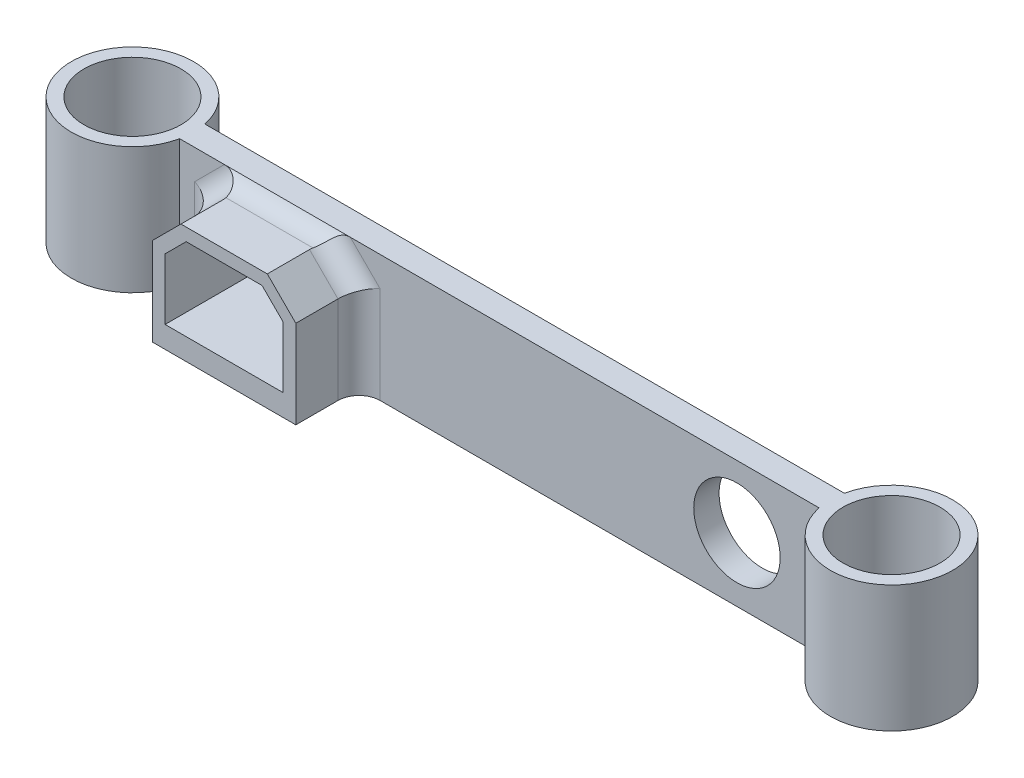
ISO-10303-21;
HEADER;
FILE_DESCRIPTION(('STEP AP214'),'2;1');
FILE_NAME('part.step','',(''),(''),'','','');
FILE_SCHEMA(('AUTOMOTIVE_DESIGN { 1 0 10303 214 1 1 1 1 }'));
ENDSEC;
DATA;
#1=APPLICATION_CONTEXT('core data for automotive mechanical design processes');
#2=APPLICATION_PROTOCOL_DEFINITION('international standard','automotive_design',2000,#1);
#3=PRODUCT_CONTEXT('',#1,'mechanical');
#4=PRODUCT('Part','Part','',(#3));
#5=PRODUCT_RELATED_PRODUCT_CATEGORY('part','',(#4));
#6=PRODUCT_DEFINITION_FORMATION('','',#4);
#7=PRODUCT_DEFINITION_CONTEXT('part definition',#1,'design');
#8=PRODUCT_DEFINITION('design','',#6,#7);
#9=PRODUCT_DEFINITION_SHAPE('','',#8);
#10=(LENGTH_UNIT() NAMED_UNIT(*) SI_UNIT(.MILLI.,.METRE.));
#11=(NAMED_UNIT(*) PLANE_ANGLE_UNIT() SI_UNIT($,.RADIAN.));
#12=(NAMED_UNIT(*) SI_UNIT($,.STERADIAN.) SOLID_ANGLE_UNIT());
#13=UNCERTAINTY_MEASURE_WITH_UNIT(LENGTH_MEASURE(1.E-05),#10,'distance_accuracy_value','');
#14=(GEOMETRIC_REPRESENTATION_CONTEXT(3) GLOBAL_UNCERTAINTY_ASSIGNED_CONTEXT((#13)) GLOBAL_UNIT_ASSIGNED_CONTEXT((#10,
#11,#12)) REPRESENTATION_CONTEXT('',''));
#15=CARTESIAN_POINT('',(0.,0.,0.));
#16=DIRECTION('',(0.,0.,1.));
#17=DIRECTION('',(1.,0.,0.));
#18=AXIS2_PLACEMENT_3D('',#15,#16,#17);
#19=CARTESIAN_POINT('',(-28.3531574831731,30.,3.00000000000001));
#20=DIRECTION('',(0.,0.,-1.));
#21=DIRECTION('',(-1.,0.,0.));
#22=AXIS2_PLACEMENT_3D('',#19,#20,#21);
#23=PLANE('',#22);
#24=DIRECTION('',(1.,0.,0.));
#25=VECTOR('',#24,1.);
#26=CARTESIAN_POINT('',(-28.3531574831731,0.,3.00000000000001));
#27=LINE('',#26,#25);
#28=CARTESIAN_POINT('',(-28.3531574831731,0.,3.00000000000001));
#29=VERTEX_POINT('',#28);
#30=CARTESIAN_POINT('',(-24.8018551834996,0.,3.00000000000001));
#31=VERTEX_POINT('',#30);
#32=EDGE_CURVE('E282',#29,#31,#27,.T.);
#33=ORIENTED_EDGE('',*,*,#32,.T.);
#34=DIRECTION('',(0.,-1.,0.));
#35=VECTOR('',#34,1.);
#36=CARTESIAN_POINT('',(-24.8018551834996,20.8662593786184,3.00000000000001));
#37=LINE('',#36,#35);
#38=CARTESIAN_POINT('',(-24.8018551834996,22.9373271904839,3.00000000000001));
#39=VERTEX_POINT('',#38);
#40=EDGE_CURVE('E319',#31,#39,#37,.F.);
#41=ORIENTED_EDGE('',*,*,#40,.T.);
#42=DIRECTION('',(-0.707106781186547,-0.707106781186548,0.));
#43=VECTOR('',#42,1.);
#44=CARTESIAN_POINT('',(-16.5800297765516,31.1591525974319,3.00000000000001));
#45=LINE('',#44,#43);
#46=CARTESIAN_POINT('',(-17.7391823739835,30.,3.00000000000001));
#47=VERTEX_POINT('',#46);
#48=EDGE_CURVE('E317',#39,#47,#45,.F.);
#49=ORIENTED_EDGE('',*,*,#48,.T.);
#50=DIRECTION('',(1.,0.,0.));
#51=VECTOR('',#50,1.);
#52=CARTESIAN_POINT('',(-28.3531574831731,30.,3.00000000000001));
#53=LINE('',#52,#51);
#54=CARTESIAN_POINT('',(-28.3531574831731,30.,3.00000000000001));
#55=VERTEX_POINT('',#54);
#56=EDGE_CURVE('E270',#55,#47,#53,.T.);
#57=ORIENTED_EDGE('',*,*,#56,.F.);
#58=DIRECTION('',(0.,-1.,0.));
#59=VECTOR('',#58,1.);
#60=CARTESIAN_POINT('',(-28.3531574831731,30.,3.00000000000001));
#61=LINE('',#60,#59);
#62=EDGE_CURVE('E296',#55,#29,#61,.T.);
#63=ORIENTED_EDGE('',*,*,#62,.T.);
#64=EDGE_LOOP('',(#33,#41,#49,#57,#63));
#65=FACE_BOUND('',#64,.T.);
#66=ADVANCED_FACE('F33',(#65),#23,.F.);
#67=CARTESIAN_POINT('',(103.805830625838,15.1399557244822,3.00000000000001));
#68=DIRECTION('',(0.,0.,-1.));
#69=DIRECTION('',(-1.,0.,0.));
#70=AXIS2_PLACEMENT_3D('',#67,#68,#69);
#71=CIRCLE('',#70,10.25);
#72=CARTESIAN_POINT('',(93.5558306258378,15.1399557244822,3.00000000000001));
#73=VERTEX_POINT('',#72);
#74=EDGE_CURVE('E466',#73,#73,#71,.T.);
#75=ORIENTED_EDGE('',*,*,#74,.T.);
#76=EDGE_LOOP('',(#75));
#77=FACE_BOUND('',#76,.T.);
#78=CARTESIAN_POINT('',(12.1354720069843,30.,3.00000000000001));
#79=VERTEX_POINT('',#78);
#80=CARTESIAN_POINT('',(123.274320598605,30.,3.00000000000001));
#81=VERTEX_POINT('',#80);
#82=EDGE_CURVE('E268',#79,#81,#53,.T.);
#83=ORIENTED_EDGE('',*,*,#82,.F.);
#84=DIRECTION('',(-0.707106781186548,0.707106781186548,0.));
#85=VECTOR('',#84,1.);
#86=CARTESIAN_POINT('',(17.7336787224331,24.4017932845512,3.00000000000001));
#87=LINE('',#86,#85);
#88=CARTESIAN_POINT('',(19.1981448165004,22.9373271904839,3.00000000000001));
#89=VERTEX_POINT('',#88);
#90=EDGE_CURVE('E315',#79,#89,#87,.F.);
#91=ORIENTED_EDGE('',*,*,#90,.T.);
#92=DIRECTION('',(0.,1.,0.));
#93=VECTOR('',#92,1.);
#94=CARTESIAN_POINT('',(19.1981448165004,0.,3.00000000000001));
#95=LINE('',#94,#93);
#96=CARTESIAN_POINT('',(19.1981448165004,0.,3.00000000000001));
#97=VERTEX_POINT('',#96);
#98=EDGE_CURVE('E313',#89,#97,#95,.F.);
#99=ORIENTED_EDGE('',*,*,#98,.T.);
#100=CARTESIAN_POINT('',(123.274320598605,0.,3.00000000000001));
#101=VERTEX_POINT('',#100);
#102=EDGE_CURVE('E281',#97,#101,#27,.T.);
#103=ORIENTED_EDGE('',*,*,#102,.T.);
#104=DIRECTION('',(0.,-1.,0.));
#105=VECTOR('',#104,1.);
#106=CARTESIAN_POINT('',(123.274320598605,30.,3.00000000000001));
#107=LINE('',#106,#105);
#108=EDGE_CURVE('E293',#81,#101,#107,.T.);
#109=ORIENTED_EDGE('',*,*,#108,.F.);
#110=EDGE_LOOP('',(#83,#91,#99,#103,#109));
#111=FACE_BOUND('',#110,.T.);
#112=ADVANCED_FACE('F409',(#77,#111),#23,.F.);
#113=CARTESIAN_POINT('',(-28.3531574831731,30.,-2.99999999999999));
#114=DIRECTION('',(0.,0.,1.));
#115=DIRECTION('',(1.,0.,0.));
#116=AXIS2_PLACEMENT_3D('',#113,#114,#115);
#117=PLANE('',#116);
#118=CARTESIAN_POINT('',(103.805830625838,15.1399557244822,-2.99999999999999));
#119=DIRECTION('',(0.,0.,-1.));
#120=DIRECTION('',(-1.,0.,0.));
#121=AXIS2_PLACEMENT_3D('',#118,#119,#120);
#122=CIRCLE('',#121,10.25);
#123=CARTESIAN_POINT('',(93.5558306258378,15.1399557244822,-2.99999999999999));
#124=VERTEX_POINT('',#123);
#125=EDGE_CURVE('E469',#124,#124,#122,.T.);
#126=ORIENTED_EDGE('',*,*,#125,.F.);
#127=EDGE_LOOP('',(#126));
#128=FACE_BOUND('',#127,.T.);
#129=DIRECTION('',(-1.,0.,0.));
#130=VECTOR('',#129,1.);
#131=CARTESIAN_POINT('',(-28.3531574831731,0.,-2.99999999999999));
#132=LINE('',#131,#130);
#133=CARTESIAN_POINT('',(123.274320598605,0.,-2.99999999999999));
#134=VERTEX_POINT('',#133);
#135=CARTESIAN_POINT('',(-28.3531574831731,0.,-2.99999999999999));
#136=VERTEX_POINT('',#135);
#137=EDGE_CURVE('E269',#134,#136,#132,.T.);
#138=ORIENTED_EDGE('',*,*,#137,.T.);
#139=DIRECTION('',(0.,-1.,0.));
#140=VECTOR('',#139,1.);
#141=CARTESIAN_POINT('',(-28.3531574831731,30.,-2.99999999999999));
#142=LINE('',#141,#140);
#143=CARTESIAN_POINT('',(-28.3531574831731,30.,-2.99999999999999));
#144=VERTEX_POINT('',#143);
#145=EDGE_CURVE('E278',#144,#136,#142,.T.);
#146=ORIENTED_EDGE('',*,*,#145,.F.);
#147=DIRECTION('',(-1.,0.,0.));
#148=VECTOR('',#147,1.);
#149=CARTESIAN_POINT('',(-28.3531574831731,30.,-2.99999999999999));
#150=LINE('',#149,#148);
#151=CARTESIAN_POINT('',(123.274320598605,30.,-2.99999999999999));
#152=VERTEX_POINT('',#151);
#153=EDGE_CURVE('E276',#152,#144,#150,.T.);
#154=ORIENTED_EDGE('',*,*,#153,.F.);
#155=DIRECTION('',(0.,-1.,0.));
#156=VECTOR('',#155,1.);
#157=CARTESIAN_POINT('',(123.274320598605,30.,-2.99999999999999));
#158=LINE('',#157,#156);
#159=EDGE_CURVE('E290',#152,#134,#158,.T.);
#160=ORIENTED_EDGE('',*,*,#159,.T.);
#161=EDGE_LOOP('',(#138,#146,#154,#160));
#162=FACE_BOUND('',#161,.T.);
#163=DIRECTION('',(0.707106781186548,-0.707106781186548,0.));
#164=VECTOR('',#163,1.);
#165=CARTESIAN_POINT('',(-13.7656969875868,44.5874604955863,-2.99999999999999));
#166=LINE('',#165,#164);
#167=CARTESIAN_POINT('',(6.19814481650038,24.6236186914991,-2.99999999999999));
#168=VERTEX_POINT('',#167);
#169=CARTESIAN_POINT('',(11.1981448165004,19.6236186914991,-2.99999999999999));
#170=VERTEX_POINT('',#169);
#171=EDGE_CURVE('E310',#168,#170,#166,.T.);
#172=ORIENTED_EDGE('',*,*,#171,.F.);
#173=DIRECTION('',(1.,0.,0.));
#174=VECTOR('',#173,1.);
#175=CARTESIAN_POINT('',(-28.3531574831731,24.6236186914991,-2.99999999999999));
#176=LINE('',#175,#174);
#177=CARTESIAN_POINT('',(-11.8018551834996,24.6236186914991,-2.99999999999999));
#178=VERTEX_POINT('',#177);
#179=EDGE_CURVE('E299',#178,#168,#176,.T.);
#180=ORIENTED_EDGE('',*,*,#179,.F.);
#181=DIRECTION('',(0.707106781186548,0.707106781186548,0.));
#182=VECTOR('',#181,1.);
#183=CARTESIAN_POINT('',(-17.3893156790859,19.0361581959128,-2.99999999999999));
#184=LINE('',#183,#182);
#185=CARTESIAN_POINT('',(-16.8018551834996,19.6236186914991,-2.99999999999999));
#186=VERTEX_POINT('',#185);
#187=EDGE_CURVE('E301',#186,#178,#184,.T.);
#188=ORIENTED_EDGE('',*,*,#187,.F.);
#189=DIRECTION('',(0.,1.,0.));
#190=VECTOR('',#189,1.);
#191=CARTESIAN_POINT('',(-16.8018551834996,30.,-2.99999999999999));
#192=LINE('',#191,#190);
#193=CARTESIAN_POINT('',(-16.8018551834996,5.12361869149913,-2.99999999999999));
#194=VERTEX_POINT('',#193);
#195=EDGE_CURVE('E304',#194,#186,#192,.T.);
#196=ORIENTED_EDGE('',*,*,#195,.F.);
#197=DIRECTION('',(-1.,0.,0.));
#198=VECTOR('',#197,1.);
#199=CARTESIAN_POINT('',(-28.3531574831731,5.12361869149913,-2.99999999999999));
#200=LINE('',#199,#198);
#201=CARTESIAN_POINT('',(11.1981448165004,5.12361869149913,-2.99999999999999));
#202=VERTEX_POINT('',#201);
#203=EDGE_CURVE('E306',#202,#194,#200,.T.);
#204=ORIENTED_EDGE('',*,*,#203,.F.);
#205=DIRECTION('',(0.,-1.,0.));
#206=VECTOR('',#205,1.);
#207=CARTESIAN_POINT('',(11.1981448165004,30.,-2.99999999999999));
#208=LINE('',#207,#206);
#209=EDGE_CURVE('E308',#170,#202,#208,.T.);
#210=ORIENTED_EDGE('',*,*,#209,.F.);
#211=EDGE_LOOP('',(#172,#180,#188,#196,#204,#210));
#212=FACE_BOUND('',#211,.T.);
#213=ADVANCED_FACE('F401',(#128,#162,#212),#117,.F.);
#214=CARTESIAN_POINT('',(-42.5394184422842,30.,0.));
#215=DIRECTION('',(0.,-1.,0.));
#216=DIRECTION('',(0.,0.,-1.));
#217=AXIS2_PLACEMENT_3D('',#214,#215,#216);
#218=PLANE('',#217);
#219=CARTESIAN_POINT('',(-42.5394184422842,30.,0.));
#220=DIRECTION('',(0.,1.,0.));
#221=DIRECTION('',(0.,0.,-1.));
#222=AXIS2_PLACEMENT_3D('',#219,#220,#221);
#223=CIRCLE('',#222,14.5);
#224=EDGE_CURVE('E265',#144,#55,#223,.T.);
#225=ORIENTED_EDGE('',*,*,#224,.T.);
#226=ORIENTED_EDGE('',*,*,#56,.T.);
#227=EDGE_CURVE('E274',#47,#79,#53,.T.);
#228=ORIENTED_EDGE('',*,*,#227,.T.);
#229=ORIENTED_EDGE('',*,*,#82,.T.);
#230=CARTESIAN_POINT('',(137.460581557716,30.,0.));
#231=DIRECTION('',(0.,1.,0.));
#232=DIRECTION('',(0.,0.,-1.));
#233=AXIS2_PLACEMENT_3D('',#230,#231,#232);
#234=CIRCLE('',#233,14.5);
#235=EDGE_CURVE('E273',#81,#152,#234,.T.);
#236=ORIENTED_EDGE('',*,*,#235,.T.);
#237=ORIENTED_EDGE('',*,*,#153,.T.);
#238=EDGE_LOOP('',(#225,#226,#228,#229,#236,#237));
#239=FACE_BOUND('',#238,.T.);
#240=CARTESIAN_POINT('',(-42.5394184422842,30.,0.));
#241=DIRECTION('',(0.,1.,0.));
#242=DIRECTION('',(0.,0.,1.));
#243=AXIS2_PLACEMENT_3D('',#240,#241,#242);
#244=CIRCLE('',#243,11.5);
#245=CARTESIAN_POINT('',(-42.5394184422842,30.,11.5));
#246=VERTEX_POINT('',#245);
#247=EDGE_CURVE('E259',#246,#246,#244,.T.);
#248=ORIENTED_EDGE('',*,*,#247,.F.);
#249=EDGE_LOOP('',(#248));
#250=FACE_BOUND('',#249,.T.);
#251=CARTESIAN_POINT('',(137.460581557716,30.,0.));
#252=DIRECTION('',(0.,1.,0.));
#253=DIRECTION('',(0.,0.,1.));
#254=AXIS2_PLACEMENT_3D('',#251,#252,#253);
#255=CIRCLE('',#254,11.5);
#256=CARTESIAN_POINT('',(137.460581557716,30.,11.5));
#257=VERTEX_POINT('',#256);
#258=EDGE_CURVE('E253',#257,#257,#255,.T.);
#259=ORIENTED_EDGE('',*,*,#258,.F.);
#260=EDGE_LOOP('',(#259));
#261=FACE_BOUND('',#260,.T.);
#262=ADVANCED_FACE('F398',(#239,#250,#261),#218,.F.);
#263=CARTESIAN_POINT('',(-42.5394184422842,0.,0.));
#264=DIRECTION('',(0.,-1.,0.));
#265=DIRECTION('',(0.,0.,-1.));
#266=AXIS2_PLACEMENT_3D('',#263,#264,#265);
#267=PLANE('',#266);
#268=CARTESIAN_POINT('',(-42.5394184422842,0.,0.));
#269=DIRECTION('',(0.,1.,0.));
#270=DIRECTION('',(0.,0.,1.));
#271=AXIS2_PLACEMENT_3D('',#268,#269,#270);
#272=CIRCLE('',#271,11.5);
#273=CARTESIAN_POINT('',(-42.5394184422842,0.,11.5));
#274=VERTEX_POINT('',#273);
#275=EDGE_CURVE('E256',#274,#274,#272,.T.);
#276=ORIENTED_EDGE('',*,*,#275,.T.);
#277=EDGE_LOOP('',(#276));
#278=FACE_BOUND('',#277,.T.);
#279=CARTESIAN_POINT('',(-42.5394184422842,0.,0.));
#280=DIRECTION('',(0.,1.,0.));
#281=DIRECTION('',(0.,0.,-1.));
#282=AXIS2_PLACEMENT_3D('',#279,#280,#281);
#283=CIRCLE('',#282,14.5);
#284=EDGE_CURVE('E262',#136,#29,#283,.T.);
#285=ORIENTED_EDGE('',*,*,#284,.F.);
#286=ORIENTED_EDGE('',*,*,#137,.F.);
#287=CARTESIAN_POINT('',(137.460581557716,0.,0.));
#288=DIRECTION('',(0.,1.,0.));
#289=DIRECTION('',(0.,0.,-1.));
#290=AXIS2_PLACEMENT_3D('',#287,#288,#289);
#291=CIRCLE('',#290,14.5);
#292=EDGE_CURVE('E285',#101,#134,#291,.T.);
#293=ORIENTED_EDGE('',*,*,#292,.F.);
#294=ORIENTED_EDGE('',*,*,#102,.F.);
#295=CARTESIAN_POINT('',(19.1981448165004,0.,8.00000000000001));
#296=DIRECTION('',(0.,-1.,0.));
#297=DIRECTION('',(0.,0.,-1.));
#298=AXIS2_PLACEMENT_3D('',#295,#296,#297);
#299=CIRCLE('',#298,5.);
#300=CARTESIAN_POINT('',(14.1981448165004,0.,8.00000000000001));
#301=VERTEX_POINT('',#300);
#302=EDGE_CURVE('E11',#97,#301,#299,.F.);
#303=ORIENTED_EDGE('',*,*,#302,.T.);
#304=DIRECTION('',(0.,0.,-1.));
#305=VECTOR('',#304,1.);
#306=CARTESIAN_POINT('',(14.1981448165004,0.,18.));
#307=LINE('',#306,#305);
#308=CARTESIAN_POINT('',(14.1981448165004,0.,18.));
#309=VERTEX_POINT('',#308);
#310=EDGE_CURVE('E197',#309,#301,#307,.T.);
#311=ORIENTED_EDGE('',*,*,#310,.F.);
#312=DIRECTION('',(1.,0.,0.));
#313=VECTOR('',#312,1.);
#314=CARTESIAN_POINT('',(-19.8018551834996,0.,18.));
#315=LINE('',#314,#313);
#316=CARTESIAN_POINT('',(-19.8018551834996,0.,18.));
#317=VERTEX_POINT('',#316);
#318=EDGE_CURVE('E180',#317,#309,#315,.T.);
#319=ORIENTED_EDGE('',*,*,#318,.F.);
#320=DIRECTION('',(0.,0.,-1.));
#321=VECTOR('',#320,1.);
#322=CARTESIAN_POINT('',(-19.8018551834996,0.,18.));
#323=LINE('',#322,#321);
#324=CARTESIAN_POINT('',(-19.8018551834996,0.,8.00000000000001));
#325=VERTEX_POINT('',#324);
#326=EDGE_CURVE('E195',#317,#325,#323,.T.);
#327=ORIENTED_EDGE('',*,*,#326,.T.);
#328=CARTESIAN_POINT('',(-24.8018551834996,0.,8.00000000000001));
#329=DIRECTION('',(0.,-1.,0.));
#330=DIRECTION('',(0.,0.,-1.));
#331=AXIS2_PLACEMENT_3D('',#328,#329,#330);
#332=CIRCLE('',#331,5.);
#333=EDGE_CURVE('E329',#325,#31,#332,.F.);
#334=ORIENTED_EDGE('',*,*,#333,.T.);
#335=ORIENTED_EDGE('',*,*,#32,.F.);
#336=EDGE_LOOP('',(#285,#286,#293,#294,#303,#311,#319,#327,#334,#335));
#337=FACE_BOUND('',#336,.T.);
#338=CARTESIAN_POINT('',(137.460581557716,0.,0.));
#339=DIRECTION('',(0.,1.,0.));
#340=DIRECTION('',(0.,0.,1.));
#341=AXIS2_PLACEMENT_3D('',#338,#339,#340);
#342=CIRCLE('',#341,11.5);
#343=CARTESIAN_POINT('',(137.460581557716,0.,11.5));
#344=VERTEX_POINT('',#343);
#345=EDGE_CURVE('E243',#344,#344,#342,.T.);
#346=ORIENTED_EDGE('',*,*,#345,.T.);
#347=EDGE_LOOP('',(#346));
#348=FACE_BOUND('',#347,.T.);
#349=ADVANCED_FACE('F193',(#278,#337,#348),#267,.T.);
#350=CARTESIAN_POINT('',(-42.5394184422842,30.,0.));
#351=DIRECTION('',(0.,-1.,0.));
#352=DIRECTION('',(0.,0.,-1.));
#353=AXIS2_PLACEMENT_3D('',#350,#351,#352);
#354=CYLINDRICAL_SURFACE('',#353,14.5);
#355=ORIENTED_EDGE('',*,*,#284,.T.);
#356=ORIENTED_EDGE('',*,*,#62,.F.);
#357=ORIENTED_EDGE('',*,*,#224,.F.);
#358=ORIENTED_EDGE('',*,*,#145,.T.);
#359=EDGE_LOOP('',(#355,#356,#357,#358));
#360=FACE_BOUND('',#359,.T.);
#361=ADVANCED_FACE('F405',(#360),#354,.T.);
#362=CARTESIAN_POINT('',(137.460581557716,30.,0.));
#363=DIRECTION('',(0.,-1.,0.));
#364=DIRECTION('',(0.,0.,-1.));
#365=AXIS2_PLACEMENT_3D('',#362,#363,#364);
#366=CYLINDRICAL_SURFACE('',#365,14.5);
#367=ORIENTED_EDGE('',*,*,#292,.T.);
#368=ORIENTED_EDGE('',*,*,#159,.F.);
#369=ORIENTED_EDGE('',*,*,#235,.F.);
#370=ORIENTED_EDGE('',*,*,#108,.T.);
#371=EDGE_LOOP('',(#367,#368,#369,#370));
#372=FACE_BOUND('',#371,.T.);
#373=ADVANCED_FACE('F396',(#372),#366,.T.);
#374=CARTESIAN_POINT('',(-42.5394184422842,30.,0.));
#375=DIRECTION('',(0.,-1.,0.));
#376=DIRECTION('',(0.,0.,-1.));
#377=AXIS2_PLACEMENT_3D('',#374,#375,#376);
#378=CYLINDRICAL_SURFACE('',#377,11.5);
#379=ORIENTED_EDGE('',*,*,#247,.T.);
#380=EDGE_LOOP('',(#379));
#381=FACE_BOUND('',#380,.T.);
#382=ORIENTED_EDGE('',*,*,#275,.F.);
#383=EDGE_LOOP('',(#382));
#384=FACE_BOUND('',#383,.T.);
#385=ADVANCED_FACE('F392',(#381,#384),#378,.F.);
#386=CARTESIAN_POINT('',(137.460581557716,30.,0.));
#387=DIRECTION('',(0.,-1.,0.));
#388=DIRECTION('',(0.,0.,-1.));
#389=AXIS2_PLACEMENT_3D('',#386,#387,#388);
#390=CYLINDRICAL_SURFACE('',#389,11.5);
#391=ORIENTED_EDGE('',*,*,#258,.T.);
#392=EDGE_LOOP('',(#391));
#393=FACE_BOUND('',#392,.T.);
#394=ORIENTED_EDGE('',*,*,#345,.F.);
#395=EDGE_LOOP('',(#394));
#396=FACE_BOUND('',#395,.T.);
#397=ADVANCED_FACE('F388',(#393,#396),#390,.F.);
#398=CARTESIAN_POINT('',(15.4108817539998,15.4108817539998,-6.99999999999999));
#399=DIRECTION('',(-0.707106781186548,-0.707106781186548,0.));
#400=DIRECTION('',(0.707106781186548,-0.707106781186548,0.));
#401=AXIS2_PLACEMENT_3D('',#398,#399,#400);
#402=PLANE('',#401);
#403=ORIENTED_EDGE('',*,*,#171,.T.);
#404=DIRECTION('',(0.,0.,1.));
#405=VECTOR('',#404,1.);
#406=CARTESIAN_POINT('',(11.1981448165004,19.6236186914991,-6.99999999999999));
#407=LINE('',#406,#405);
#408=CARTESIAN_POINT('',(11.1981448165004,19.6236186914991,18.));
#409=VERTEX_POINT('',#408);
#410=EDGE_CURVE('E241',#170,#409,#407,.T.);
#411=ORIENTED_EDGE('',*,*,#410,.T.);
#412=DIRECTION('',(-0.707106781186548,0.707106781186547,0.));
#413=VECTOR('',#412,1.);
#414=CARTESIAN_POINT('',(11.1981448165004,19.6236186914991,18.));
#415=LINE('',#414,#413);
#416=CARTESIAN_POINT('',(6.19814481650038,24.6236186914991,18.));
#417=VERTEX_POINT('',#416);
#418=EDGE_CURVE('E221',#409,#417,#415,.T.);
#419=ORIENTED_EDGE('',*,*,#418,.T.);
#420=DIRECTION('',(0.,0.,1.));
#421=VECTOR('',#420,1.);
#422=CARTESIAN_POINT('',(6.19814481650038,24.6236186914991,-6.99999999999999));
#423=LINE('',#422,#421);
#424=EDGE_CURVE('E240',#168,#417,#423,.T.);
#425=ORIENTED_EDGE('',*,*,#424,.F.);
#426=EDGE_LOOP('',(#403,#411,#419,#425));
#427=FACE_BOUND('',#426,.T.);
#428=ADVANCED_FACE('F369',(#427),#402,.T.);
#429=CARTESIAN_POINT('',(11.1981448165004,0.,-6.99999999999999));
#430=DIRECTION('',(-1.,0.,0.));
#431=DIRECTION('',(0.,0.,1.));
#432=AXIS2_PLACEMENT_3D('',#429,#430,#431);
#433=PLANE('',#432);
#434=ORIENTED_EDGE('',*,*,#209,.T.);
#435=DIRECTION('',(0.,0.,1.));
#436=VECTOR('',#435,1.);
#437=CARTESIAN_POINT('',(11.1981448165004,5.12361869149913,-6.99999999999999));
#438=LINE('',#437,#436);
#439=CARTESIAN_POINT('',(11.1981448165004,5.12361869149913,18.));
#440=VERTEX_POINT('',#439);
#441=EDGE_CURVE('E244',#202,#440,#438,.T.);
#442=ORIENTED_EDGE('',*,*,#441,.T.);
#443=DIRECTION('',(0.,1.,0.));
#444=VECTOR('',#443,1.);
#445=CARTESIAN_POINT('',(11.1981448165004,5.12361869149913,18.));
#446=LINE('',#445,#444);
#447=EDGE_CURVE('E218',#440,#409,#446,.T.);
#448=ORIENTED_EDGE('',*,*,#447,.T.);
#449=ORIENTED_EDGE('',*,*,#410,.F.);
#450=EDGE_LOOP('',(#434,#442,#448,#449));
#451=FACE_BOUND('',#450,.T.);
#452=ADVANCED_FACE('F365',(#451),#433,.T.);
#453=CARTESIAN_POINT('',(0.,5.12361869149913,-6.99999999999999));
#454=DIRECTION('',(0.,1.,0.));
#455=DIRECTION('',(-1.,0.,0.));
#456=AXIS2_PLACEMENT_3D('',#453,#454,#455);
#457=PLANE('',#456);
#458=ORIENTED_EDGE('',*,*,#203,.T.);
#459=DIRECTION('',(0.,0.,1.));
#460=VECTOR('',#459,1.);
#461=CARTESIAN_POINT('',(-16.8018551834996,5.12361869149913,-6.99999999999999));
#462=LINE('',#461,#460);
#463=CARTESIAN_POINT('',(-16.8018551834996,5.12361869149913,18.));
#464=VERTEX_POINT('',#463);
#465=EDGE_CURVE('E246',#194,#464,#462,.T.);
#466=ORIENTED_EDGE('',*,*,#465,.T.);
#467=DIRECTION('',(1.,0.,0.));
#468=VECTOR('',#467,1.);
#469=CARTESIAN_POINT('',(-16.8018551834996,5.12361869149913,18.));
#470=LINE('',#469,#468);
#471=EDGE_CURVE('E215',#464,#440,#470,.T.);
#472=ORIENTED_EDGE('',*,*,#471,.T.);
#473=ORIENTED_EDGE('',*,*,#441,.F.);
#474=EDGE_LOOP('',(#458,#466,#472,#473));
#475=FACE_BOUND('',#474,.T.);
#476=ADVANCED_FACE('F368',(#475),#457,.T.);
#477=CARTESIAN_POINT('',(-16.8018551834996,0.,-6.99999999999999));
#478=DIRECTION('',(1.,0.,0.));
#479=DIRECTION('',(0.,0.,-1.));
#480=AXIS2_PLACEMENT_3D('',#477,#478,#479);
#481=PLANE('',#480);
#482=ORIENTED_EDGE('',*,*,#195,.T.);
#483=DIRECTION('',(0.,0.,1.));
#484=VECTOR('',#483,1.);
#485=CARTESIAN_POINT('',(-16.8018551834996,19.6236186914991,-6.99999999999999));
#486=LINE('',#485,#484);
#487=CARTESIAN_POINT('',(-16.8018551834996,19.6236186914991,18.));
#488=VERTEX_POINT('',#487);
#489=EDGE_CURVE('E248',#186,#488,#486,.T.);
#490=ORIENTED_EDGE('',*,*,#489,.T.);
#491=DIRECTION('',(0.,-1.,0.));
#492=VECTOR('',#491,1.);
#493=CARTESIAN_POINT('',(-16.8018551834996,19.6236186914991,18.));
#494=LINE('',#493,#492);
#495=EDGE_CURVE('E212',#488,#464,#494,.T.);
#496=ORIENTED_EDGE('',*,*,#495,.T.);
#497=ORIENTED_EDGE('',*,*,#465,.F.);
#498=EDGE_LOOP('',(#482,#490,#496,#497));
#499=FACE_BOUND('',#498,.T.);
#500=ADVANCED_FACE('F373',(#499),#481,.T.);
#501=CARTESIAN_POINT('',(-18.2127369374994,18.2127369374994,-6.99999999999999));
#502=DIRECTION('',(0.707106781186548,-0.707106781186548,0.));
#503=DIRECTION('',(0.707106781186548,0.707106781186548,0.));
#504=AXIS2_PLACEMENT_3D('',#501,#502,#503);
#505=PLANE('',#504);
#506=ORIENTED_EDGE('',*,*,#187,.T.);
#507=DIRECTION('',(0.,0.,1.));
#508=VECTOR('',#507,1.);
#509=CARTESIAN_POINT('',(-11.8018551834996,24.6236186914991,-6.99999999999999));
#510=LINE('',#509,#508);
#511=CARTESIAN_POINT('',(-11.8018551834996,24.6236186914991,18.));
#512=VERTEX_POINT('',#511);
#513=EDGE_CURVE('E250',#178,#512,#510,.T.);
#514=ORIENTED_EDGE('',*,*,#513,.T.);
#515=DIRECTION('',(-0.707106781186548,-0.707106781186548,0.));
#516=VECTOR('',#515,1.);
#517=CARTESIAN_POINT('',(-11.8018551834996,24.6236186914991,18.));
#518=LINE('',#517,#516);
#519=EDGE_CURVE('E206',#512,#488,#518,.T.);
#520=ORIENTED_EDGE('',*,*,#519,.T.);
#521=ORIENTED_EDGE('',*,*,#489,.F.);
#522=EDGE_LOOP('',(#506,#514,#520,#521));
#523=FACE_BOUND('',#522,.T.);
#524=ADVANCED_FACE('F377',(#523),#505,.T.);
#525=CARTESIAN_POINT('',(0.,24.6236186914991,-6.99999999999999));
#526=DIRECTION('',(0.,-1.,0.));
#527=DIRECTION('',(0.,0.,-1.));
#528=AXIS2_PLACEMENT_3D('',#525,#526,#527);
#529=PLANE('',#528);
#530=ORIENTED_EDGE('',*,*,#179,.T.);
#531=ORIENTED_EDGE('',*,*,#424,.T.);
#532=DIRECTION('',(-1.,0.,0.));
#533=VECTOR('',#532,1.);
#534=CARTESIAN_POINT('',(6.19814481650038,24.6236186914991,18.));
#535=LINE('',#534,#533);
#536=EDGE_CURVE('E203',#417,#512,#535,.T.);
#537=ORIENTED_EDGE('',*,*,#536,.T.);
#538=ORIENTED_EDGE('',*,*,#513,.F.);
#539=EDGE_LOOP('',(#530,#531,#537,#538));
#540=FACE_BOUND('',#539,.T.);
#541=ADVANCED_FACE('F381',(#540),#529,.T.);
#542=CARTESIAN_POINT('',(0.,0.,18.));
#543=DIRECTION('',(0.,0.,-1.));
#544=DIRECTION('',(-1.,0.,0.));
#545=AXIS2_PLACEMENT_3D('',#542,#543,#544);
#546=PLANE('',#545);
#547=DIRECTION('',(-0.707106781186547,-0.707106781186548,0.));
#548=VECTOR('',#547,1.);
#549=CARTESIAN_POINT('',(-19.8018551834996,20.8662593786184,18.));
#550=LINE('',#549,#548);
#551=CARTESIAN_POINT('',(-13.0444958706189,27.6236186914991,18.));
#552=VERTEX_POINT('',#551);
#553=CARTESIAN_POINT('',(-19.8018551834996,20.8662593786184,18.));
#554=VERTEX_POINT('',#553);
#555=EDGE_CURVE('E183',#552,#554,#550,.T.);
#556=ORIENTED_EDGE('',*,*,#555,.T.);
#557=DIRECTION('',(0.,-1.,0.));
#558=VECTOR('',#557,1.);
#559=CARTESIAN_POINT('',(-19.8018551834996,2.12361869149912,18.));
#560=LINE('',#559,#558);
#561=EDGE_CURVE('E176',#554,#317,#560,.T.);
#562=ORIENTED_EDGE('',*,*,#561,.T.);
#563=ORIENTED_EDGE('',*,*,#318,.T.);
#564=DIRECTION('',(0.,1.,0.));
#565=VECTOR('',#564,1.);
#566=CARTESIAN_POINT('',(14.1981448165004,20.8662593786184,18.));
#567=LINE('',#566,#565);
#568=CARTESIAN_POINT('',(14.1981448165004,20.8662593786184,18.));
#569=VERTEX_POINT('',#568);
#570=EDGE_CURVE('E188',#309,#569,#567,.T.);
#571=ORIENTED_EDGE('',*,*,#570,.T.);
#572=DIRECTION('',(-0.707106781186548,0.707106781186548,0.));
#573=VECTOR('',#572,1.);
#574=CARTESIAN_POINT('',(7.44078550361967,27.6236186914991,18.));
#575=LINE('',#574,#573);
#576=CARTESIAN_POINT('',(7.44078550361967,27.6236186914991,18.));
#577=VERTEX_POINT('',#576);
#578=EDGE_CURVE('E226',#569,#577,#575,.T.);
#579=ORIENTED_EDGE('',*,*,#578,.T.);
#580=DIRECTION('',(-1.,0.,0.));
#581=VECTOR('',#580,1.);
#582=CARTESIAN_POINT('',(-13.0444958706189,27.6236186914991,18.));
#583=LINE('',#582,#581);
#584=EDGE_CURVE('E228',#577,#552,#583,.T.);
#585=ORIENTED_EDGE('',*,*,#584,.T.);
#586=EDGE_LOOP('',(#556,#562,#563,#571,#579,#585));
#587=FACE_BOUND('',#586,.T.);
#588=ORIENTED_EDGE('',*,*,#536,.F.);
#589=ORIENTED_EDGE('',*,*,#418,.F.);
#590=ORIENTED_EDGE('',*,*,#447,.F.);
#591=ORIENTED_EDGE('',*,*,#471,.F.);
#592=ORIENTED_EDGE('',*,*,#495,.F.);
#593=ORIENTED_EDGE('',*,*,#519,.F.);
#594=EDGE_LOOP('',(#588,#589,#590,#591,#592,#593));
#595=FACE_BOUND('',#594,.T.);
#596=ADVANCED_FACE('F178',(#587,#595),#546,.F.);
#597=CARTESIAN_POINT('',(-19.8018551834996,20.8662593786184,18.));
#598=DIRECTION('',(0.707106781186548,-0.707106781186547,0.));
#599=DIRECTION('',(0.707106781186547,0.707106781186548,0.));
#600=AXIS2_PLACEMENT_3D('',#597,#598,#599);
#601=PLANE('',#600);
#602=DIRECTION('',(0.,0.,-1.));
#603=VECTOR('',#602,1.);
#604=CARTESIAN_POINT('',(-13.0444958706189,27.6236186914991,18.));
#605=LINE('',#604,#603);
#606=CARTESIAN_POINT('',(-13.0444958706189,27.6236186914991,8.00000000000001));
#607=VERTEX_POINT('',#606);
#608=EDGE_CURVE('E230',#552,#607,#605,.T.);
#609=ORIENTED_EDGE('',*,*,#608,.T.);
#610=DIRECTION('',(-0.707106781186547,-0.707106781186548,0.));
#611=VECTOR('',#610,1.);
#612=CARTESIAN_POINT('',(-19.8018551834996,20.8662593786184,8.00000000000001));
#613=LINE('',#612,#611);
#614=CARTESIAN_POINT('',(-19.8018551834996,20.8662593786184,8.00000000000001));
#615=VERTEX_POINT('',#614);
#616=EDGE_CURVE('E321',#607,#615,#613,.T.);
#617=ORIENTED_EDGE('',*,*,#616,.T.);
#618=DIRECTION('',(0.,0.,-1.));
#619=VECTOR('',#618,1.);
#620=CARTESIAN_POINT('',(-19.8018551834996,20.8662593786184,18.));
#621=LINE('',#620,#619);
#622=EDGE_CURVE('E238',#554,#615,#621,.T.);
#623=ORIENTED_EDGE('',*,*,#622,.F.);
#624=ORIENTED_EDGE('',*,*,#555,.F.);
#625=EDGE_LOOP('',(#609,#617,#623,#624));
#626=FACE_BOUND('',#625,.T.);
#627=ADVANCED_FACE('F361',(#626),#601,.F.);
#628=CARTESIAN_POINT('',(-19.8018551834996,2.12361869149912,18.));
#629=DIRECTION('',(1.,0.,0.));
#630=DIRECTION('',(0.,0.,-1.));
#631=AXIS2_PLACEMENT_3D('',#628,#629,#630);
#632=PLANE('',#631);
#633=ORIENTED_EDGE('',*,*,#622,.T.);
#634=DIRECTION('',(0.,-1.,0.));
#635=VECTOR('',#634,1.);
#636=CARTESIAN_POINT('',(-19.8018551834996,0.,8.00000000000001));
#637=LINE('',#636,#635);
#638=EDGE_CURVE('E202',#615,#325,#637,.T.);
#639=ORIENTED_EDGE('',*,*,#638,.T.);
#640=ORIENTED_EDGE('',*,*,#326,.F.);
#641=ORIENTED_EDGE('',*,*,#561,.F.);
#642=EDGE_LOOP('',(#633,#639,#640,#641));
#643=FACE_BOUND('',#642,.T.);
#644=ADVANCED_FACE('F200',(#643),#632,.F.);
#645=CARTESIAN_POINT('',(14.1981448165004,20.8662593786184,18.));
#646=DIRECTION('',(-1.,0.,0.));
#647=DIRECTION('',(0.,-1.,0.));
#648=AXIS2_PLACEMENT_3D('',#645,#646,#647);
#649=PLANE('',#648);
#650=ORIENTED_EDGE('',*,*,#310,.T.);
#651=DIRECTION('',(0.,1.,0.));
#652=VECTOR('',#651,1.);
#653=CARTESIAN_POINT('',(14.1981448165004,20.8662593786184,8.00000000000001));
#654=LINE('',#653,#652);
#655=CARTESIAN_POINT('',(14.1981448165004,20.8662593786184,8.00000000000001));
#656=VERTEX_POINT('',#655);
#657=EDGE_CURVE('E327',#301,#656,#654,.T.);
#658=ORIENTED_EDGE('',*,*,#657,.T.);
#659=DIRECTION('',(0.,0.,-1.));
#660=VECTOR('',#659,1.);
#661=CARTESIAN_POINT('',(14.1981448165004,20.8662593786184,18.));
#662=LINE('',#661,#660);
#663=EDGE_CURVE('E235',#569,#656,#662,.T.);
#664=ORIENTED_EDGE('',*,*,#663,.F.);
#665=ORIENTED_EDGE('',*,*,#570,.F.);
#666=EDGE_LOOP('',(#650,#658,#664,#665));
#667=FACE_BOUND('',#666,.T.);
#668=ADVANCED_FACE('F354',(#667),#649,.F.);
#669=CARTESIAN_POINT('',(7.44078550361967,27.6236186914991,18.));
#670=DIRECTION('',(-0.707106781186547,-0.707106781186547,0.));
#671=DIRECTION('',(0.707106781186548,-0.707106781186548,0.));
#672=AXIS2_PLACEMENT_3D('',#669,#670,#671);
#673=PLANE('',#672);
#674=ORIENTED_EDGE('',*,*,#663,.T.);
#675=DIRECTION('',(-0.707106781186548,0.707106781186548,0.));
#676=VECTOR('',#675,1.);
#677=CARTESIAN_POINT('',(7.44078550361966,27.6236186914991,8.00000000000001));
#678=LINE('',#677,#676);
#679=CARTESIAN_POINT('',(7.44078550361967,27.6236186914991,8.00000000000001));
#680=VERTEX_POINT('',#679);
#681=EDGE_CURVE('E325',#656,#680,#678,.T.);
#682=ORIENTED_EDGE('',*,*,#681,.T.);
#683=DIRECTION('',(0.,0.,-1.));
#684=VECTOR('',#683,1.);
#685=CARTESIAN_POINT('',(7.44078550361967,27.6236186914991,18.));
#686=LINE('',#685,#684);
#687=EDGE_CURVE('E233',#577,#680,#686,.T.);
#688=ORIENTED_EDGE('',*,*,#687,.F.);
#689=ORIENTED_EDGE('',*,*,#578,.F.);
#690=EDGE_LOOP('',(#674,#682,#688,#689));
#691=FACE_BOUND('',#690,.T.);
#692=ADVANCED_FACE('F349',(#691),#673,.F.);
#693=CARTESIAN_POINT('',(-13.0444958706189,27.6236186914991,18.));
#694=DIRECTION('',(0.,-1.,0.));
#695=DIRECTION('',(1.,0.,0.));
#696=AXIS2_PLACEMENT_3D('',#693,#694,#695);
#697=PLANE('',#696);
#698=ORIENTED_EDGE('',*,*,#687,.T.);
#699=CARTESIAN_POINT('',(14.5118533154851,27.6236186914991,8.00000000000001));
#700=DIRECTION('',(0.,-1.,0.));
#701=DIRECTION('',(1.,0.,0.));
#702=AXIS2_PLACEMENT_3D('',#699,#700,#701);
#703=ELLIPSE('',#702,7.07106781186547,5.);
#704=CARTESIAN_POINT('',(7.51942829508628,27.6236186914991,7.25636287945664));
#705=VERTEX_POINT('',#704);
#706=EDGE_CURVE('E42',#680,#705,#703,.T.);
#707=ORIENTED_EDGE('',*,*,#706,.T.);
#708=CARTESIAN_POINT('',(7.51942829508628,27.6236186914991,7.25636287945664));
#709=CARTESIAN_POINT('',(7.44078550361967,27.6236186914991,7.25636287945664));
#710=B_SPLINE_CURVE_WITH_KNOTS('',1,(#708,#709),.UNSPECIFIED.,.F.,.F.,(2,2),(0.,1.),.UNSPECIFIED.);
#711=CARTESIAN_POINT('',(7.44078550361967,27.6236186914991,7.25636287945664));
#712=VERTEX_POINT('',#711);
#713=EDGE_CURVE('E336',#705,#712,#710,.T.);
#714=ORIENTED_EDGE('',*,*,#713,.T.);
#715=DIRECTION('',(-1.,0.,0.));
#716=VECTOR('',#715,1.);
#717=CARTESIAN_POINT('',(-13.0444958706189,27.6236186914991,7.25636287945664));
#718=LINE('',#717,#716);
#719=CARTESIAN_POINT('',(-13.0444958706189,27.6236186914991,7.25636287945664));
#720=VERTEX_POINT('',#719);
#721=EDGE_CURVE('E323',#712,#720,#718,.T.);
#722=ORIENTED_EDGE('',*,*,#721,.T.);
#723=CARTESIAN_POINT('',(-13.0444958706189,27.6236186914991,7.25636287945664));
#724=CARTESIAN_POINT('',(-13.1231386620855,27.6236186914991,7.25636287945664));
#725=B_SPLINE_CURVE_WITH_KNOTS('',1,(#723,#724),.UNSPECIFIED.,.F.,.F.,(2,2),(0.,1.),.UNSPECIFIED.);
#726=CARTESIAN_POINT('',(-13.1231386620855,27.6236186914991,7.25636287945664));
#727=VERTEX_POINT('',#726);
#728=EDGE_CURVE('E56',#720,#727,#725,.T.);
#729=ORIENTED_EDGE('',*,*,#728,.T.);
#730=CARTESIAN_POINT('',(-20.1155636824844,27.6236186914991,8.00000000000001));
#731=DIRECTION('',(0.,-1.,0.));
#732=DIRECTION('',(1.,0.,0.));
#733=AXIS2_PLACEMENT_3D('',#730,#731,#732);
#734=ELLIPSE('',#733,7.07106781186547,5.);
#735=EDGE_CURVE('E331',#727,#607,#734,.T.);
#736=ORIENTED_EDGE('',*,*,#735,.T.);
#737=ORIENTED_EDGE('',*,*,#608,.F.);
#738=ORIENTED_EDGE('',*,*,#584,.F.);
#739=EDGE_LOOP('',(#698,#707,#714,#722,#729,#736,#737,#738));
#740=FACE_BOUND('',#739,.T.);
#741=ADVANCED_FACE('F339',(#740),#697,.F.);
#742=CARTESIAN_POINT('',(19.1981448165004,20.8662593786184,8.00000000000001));
#743=DIRECTION('',(0.,-1.,0.));
#744=DIRECTION('',(1.,0.,0.));
#745=AXIS2_PLACEMENT_3D('',#742,#743,#744);
#746=CYLINDRICAL_SURFACE('',#745,5.);
#747=ORIENTED_EDGE('',*,*,#302,.F.);
#748=ORIENTED_EDGE('',*,*,#98,.F.);
#749=CARTESIAN_POINT('',(19.1981448165004,22.9373271904839,8.00000000000001));
#750=DIRECTION('',(0.38268343236509,-0.923879532511287,0.));
#751=DIRECTION('',(-0.923879532511287,-0.38268343236509,0.));
#752=AXIS2_PLACEMENT_3D('',#749,#750,#751);
#753=ELLIPSE('',#752,5.41196100146197,5.);
#754=EDGE_CURVE('E37',#656,#89,#753,.T.);
#755=ORIENTED_EDGE('',*,*,#754,.F.);
#756=ORIENTED_EDGE('',*,*,#657,.F.);
#757=EDGE_LOOP('',(#747,#748,#755,#756));
#758=FACE_BOUND('',#757,.T.);
#759=ADVANCED_FACE('F35',(#758),#746,.F.);
#760=CARTESIAN_POINT('',(10.9763194095524,31.1591525974319,8.00000000000001));
#761=DIRECTION('',(0.707106781186548,-0.707106781186548,0.));
#762=DIRECTION('',(0.707106781186548,0.707106781186548,0.));
#763=AXIS2_PLACEMENT_3D('',#760,#761,#762);
#764=CYLINDRICAL_SURFACE('',#763,5.);
#765=ORIENTED_EDGE('',*,*,#754,.T.);
#766=ORIENTED_EDGE('',*,*,#90,.F.);
#767=CARTESIAN_POINT('',(12.1354720069843,30.,3.00000000000001));
#768=CARTESIAN_POINT('',(12.0315550708357,30.0000131713633,3.00001433058456));
#769=CARTESIAN_POINT('',(11.9275642699384,29.9973743398401,3.00162073628848));
#770=CARTESIAN_POINT('',(11.7198535252067,29.9860346770072,3.0086282576166));
#771=CARTESIAN_POINT('',(11.6161344808192,29.9773222520903,3.01403663081041));
#772=CARTESIAN_POINT('',(11.4099941842211,29.9530957935901,3.02924804956024));
#773=CARTESIAN_POINT('',(11.3075707559806,29.9375953618725,3.03904230752376));
#774=CARTESIAN_POINT('',(11.104759033744,29.8993160791932,3.06366720713071));
#775=CARTESIAN_POINT('',(11.0043694259575,29.8765420972265,3.07849448003422));
#776=CARTESIAN_POINT('',(10.8054266413085,29.8233238647586,3.11397464935256));
#777=CARTESIAN_POINT('',(10.7069071392181,29.7927956664677,3.13469162148989));
#778=CARTESIAN_POINT('',(10.5138827920103,29.724650914277,3.1823342043679));
#779=CARTESIAN_POINT('',(10.4193786039833,29.6870332056395,3.20926082669479));
#780=CARTESIAN_POINT('',(10.2353444627743,29.6057588262738,3.26950074321285));
#781=CARTESIAN_POINT('',(10.1458062854945,29.56211258487,3.30280304512586));
#782=CARTESIAN_POINT('',(9.97197272243825,29.4700478905988,3.3758421016159));
#783=CARTESIAN_POINT('',(9.88767791815368,29.4216289099665,3.41557956810017));
#784=CARTESIAN_POINT('',(9.71356646200021,29.3147807932327,3.50707383799737));
#785=CARTESIAN_POINT('',(9.62451294556943,29.2558778898638,3.55972684346099));
#786=CARTESIAN_POINT('',(9.45310558535619,29.1358206048256,3.67278006217261));
#787=CARTESIAN_POINT('',(9.37075305545822,29.0746657850137,3.73318178878451));
#788=CARTESIAN_POINT('',(9.2121514266133,28.9517395650361,3.86148175525124));
#789=CARTESIAN_POINT('',(9.13591873779096,28.8899669758768,3.9293990606808));
#790=CARTESIAN_POINT('',(8.98933958242332,28.7674900881793,4.07216438179259));
#791=CARTESIAN_POINT('',(8.91899288229701,28.706785747324,4.14701212219716));
#792=CARTESIAN_POINT('',(8.78225936405728,28.5864081454217,4.30492186849228));
#793=CARTESIAN_POINT('',(8.71599376133453,28.5267869753657,4.38812839691395));
#794=CARTESIAN_POINT('',(8.5887615465278,28.4111383292909,4.56084567946492));
#795=CARTESIAN_POINT('',(8.52779493874077,28.3551108561861,4.6503564387062));
#796=CARTESIAN_POINT('',(8.41086627811297,28.2476443936446,4.83515054118771));
#797=CARTESIAN_POINT('',(8.354902266296,28.1962036081181,4.93043160008871));
#798=CARTESIAN_POINT('',(8.24770456637776,28.0987226900676,5.1262728122644));
#799=CARTESIAN_POINT('',(8.1964710480186,28.0526827513236,5.22683315477023));
#800=CARTESIAN_POINT('',(8.09100575625537,27.9601177103874,5.44851493878495));
#801=CARTESIAN_POINT('',(8.03752453145166,27.9146068032821,5.5704201574805));
#802=CARTESIAN_POINT('',(7.9363912520511,27.8327186798198,5.81953857601071));
#803=CARTESIAN_POINT('',(7.88873696423687,27.7963379585887,5.94674971708322));
#804=CARTESIAN_POINT('',(7.79908541386556,27.7335117709125,6.20538772151374));
#805=CARTESIAN_POINT('',(7.75708235077902,27.7070560665585,6.33681008810197));
#806=CARTESIAN_POINT('',(7.67851198391402,27.6646797672817,6.60287111656425));
#807=CARTESIAN_POINT('',(7.64194131158242,27.6487526224189,6.73750772469608));
#808=CARTESIAN_POINT('',(7.59208860433114,27.6334399879742,6.936704286435));
#809=CARTESIAN_POINT('',(7.57676423602523,27.6297620208547,7.00045441436609));
#810=CARTESIAN_POINT('',(7.54725566078055,27.6248530048262,7.12821609418481));
#811=CARTESIAN_POINT('',(7.53306986344297,27.6236184836666,7.19222714538858));
#812=CARTESIAN_POINT('',(7.51942829508629,27.6236186914991,7.25636287945664));
#813=B_SPLINE_CURVE_WITH_KNOTS('',3,(#767,#768,#769,#770,#771,#772,#773,#774,#775,#776,#777,
#778,#779,#780,#781,#782,#783,#784,#785,#786,#787,#788,#789,#790,#791,#792,#793,#794,#795,#796,
#797,#798,#799,#800,#801,#802,#803,#804,#805,#806,#807,#808,#809,#810,#811,#812),.UNSPECIFIED.,
.F.,.F.,(4,2,2,2,2,2,2,2,2,2,2,2,2,2,2,2,2,2,2,2,2,2,4),(0.,0.31181610230928,0.624229051891736,
0.936018829909786,1.24760032833049,1.56271061307196,1.87787226732056,2.19249536809994,
2.5071532987062,2.86378060058215,3.22047765989041,3.5781012851214,3.93571071159018,
4.30119008895361,4.66666976268099,5.03200568474698,5.39735471090197,5.81888811945516,
6.24025946238808,6.66119494700419,7.08186831566275,7.27882848170546,7.4755085566525),.UNSPECIFIED.);
#814=EDGE_CURVE('E440',#705,#79,#813,.F.);
#815=ORIENTED_EDGE('',*,*,#814,.F.);
#816=ORIENTED_EDGE('',*,*,#706,.F.);
#817=ORIENTED_EDGE('',*,*,#681,.F.);
#818=EDGE_LOOP('',(#765,#766,#815,#816,#817));
#819=FACE_BOUND('',#818,.T.);
#820=ADVANCED_FACE('F430',(#819),#764,.F.);
#821=CARTESIAN_POINT('',(-28.3531574831731,32.6236186914991,7.25636287945664));
#822=DIRECTION('',(-1.,0.,0.));
#823=DIRECTION('',(0.,0.,1.));
#824=AXIS2_PLACEMENT_3D('',#821,#822,#823);
#825=CYLINDRICAL_SURFACE('',#824,5.);
#826=ORIENTED_EDGE('',*,*,#814,.T.);
#827=ORIENTED_EDGE('',*,*,#227,.F.);
#828=CARTESIAN_POINT('',(-17.7391823739835,30.,3.00000000000001));
#829=CARTESIAN_POINT('',(-17.6352654378349,30.0000131713633,3.00001433058456));
#830=CARTESIAN_POINT('',(-17.5312746369377,29.9973743398401,3.00162073628848));
#831=CARTESIAN_POINT('',(-17.3235638922059,29.9860346770072,3.0086282576166));
#832=CARTESIAN_POINT('',(-17.2198448478184,29.9773222520903,3.01403663081041));
#833=CARTESIAN_POINT('',(-17.0137045512203,29.9530957935901,3.02924804956024));
#834=CARTESIAN_POINT('',(-16.9112811229798,29.9375953618725,3.03904230752376));
#835=CARTESIAN_POINT('',(-16.7084694007432,29.8993160791932,3.06366720713071));
#836=CARTESIAN_POINT('',(-16.6080797929568,29.8765420972265,3.07849448003422));
#837=CARTESIAN_POINT('',(-16.4091370083077,29.8233238647586,3.11397464935256));
#838=CARTESIAN_POINT('',(-16.3106175062173,29.7927956664677,3.13469162148989));
#839=CARTESIAN_POINT('',(-16.1175931590095,29.724650914277,3.18233420436791));
#840=CARTESIAN_POINT('',(-16.0230889709826,29.6870332056395,3.2092608266948));
#841=CARTESIAN_POINT('',(-15.8390548297735,29.6057588262738,3.26950074321285));
#842=CARTESIAN_POINT('',(-15.7495166524937,29.56211258487,3.30280304512586));
#843=CARTESIAN_POINT('',(-15.5756830894375,29.4700478905988,3.3758421016159));
#844=CARTESIAN_POINT('',(-15.4913882851529,29.4216289099665,3.41557956810017));
#845=CARTESIAN_POINT('',(-15.3172768289994,29.3147807932327,3.50707383799737));
#846=CARTESIAN_POINT('',(-15.2282233125687,29.2558778898638,3.55972684346099));
#847=CARTESIAN_POINT('',(-15.0568159523554,29.1358206048256,3.67278006217261));
#848=CARTESIAN_POINT('',(-14.9744634224574,29.0746657850137,3.73318178878452));
#849=CARTESIAN_POINT('',(-14.8158617936125,28.9517395650361,3.86148175525124));
#850=CARTESIAN_POINT('',(-14.7396291047902,28.8899669758768,3.9293990606808));
#851=CARTESIAN_POINT('',(-14.5930499494226,28.7674900881793,4.07216438179259));
#852=CARTESIAN_POINT('',(-14.5227032492962,28.706785747324,4.14701212219716));
#853=CARTESIAN_POINT('',(-14.3859697310565,28.5864081454217,4.30492186849227));
#854=CARTESIAN_POINT('',(-14.3197041283338,28.5267869753657,4.38812839691395));
#855=CARTESIAN_POINT('',(-14.192471913527,28.4111383292909,4.56084567946491));
#856=CARTESIAN_POINT('',(-14.13150530574,28.3551108561861,4.65035643870619));
#857=CARTESIAN_POINT('',(-14.0145766451122,28.2476443936446,4.83515054118771));
#858=CARTESIAN_POINT('',(-13.9586126332952,28.1962036081181,4.93043160008871));
#859=CARTESIAN_POINT('',(-13.851414933377,28.0987226900676,5.1262728122644));
#860=CARTESIAN_POINT('',(-13.8001814150178,28.0526827513236,5.22683315477023));
#861=CARTESIAN_POINT('',(-13.6947161232546,27.9601177103874,5.44851493878495));
#862=CARTESIAN_POINT('',(-13.6412348984509,27.9146068032821,5.57042015748049));
#863=CARTESIAN_POINT('',(-13.5401016190503,27.8327186798198,5.81953857601071));
#864=CARTESIAN_POINT('',(-13.4924473312361,27.7963379585887,5.94674971708322));
#865=CARTESIAN_POINT('',(-13.4027957808648,27.7335117709125,6.20538772151373));
#866=CARTESIAN_POINT('',(-13.3607927177782,27.7070560665585,6.33681008810197));
#867=CARTESIAN_POINT('',(-13.2822223509132,27.6646797672817,6.60287111656425));
#868=CARTESIAN_POINT('',(-13.2456516785817,27.6487526224189,6.73750772469607));
#869=CARTESIAN_POINT('',(-13.1957989713304,27.6334399879742,6.936704286435));
#870=CARTESIAN_POINT('',(-13.1804746030245,27.6297620208547,7.00045441436609));
#871=CARTESIAN_POINT('',(-13.1509660277798,27.6248530048262,7.12821609418481));
#872=CARTESIAN_POINT('',(-13.1367802304422,27.6236184836666,7.19222714538858));
#873=CARTESIAN_POINT('',(-13.1231386620855,27.6236186914991,7.25636287945664));
#874=B_SPLINE_CURVE_WITH_KNOTS('',3,(#828,#829,#830,#831,#832,#833,#834,#835,#836,#837,#838,
#839,#840,#841,#842,#843,#844,#845,#846,#847,#848,#849,#850,#851,#852,#853,#854,#855,#856,#857,
#858,#859,#860,#861,#862,#863,#864,#865,#866,#867,#868,#869,#870,#871,#872,#873),.UNSPECIFIED.,
.F.,.F.,(4,2,2,2,2,2,2,2,2,2,2,2,2,2,2,2,2,2,2,2,2,2,4),(0.,0.311816102309283,0.624229051891733,
0.936018829909784,1.24760032833049,1.56271061307196,1.87787226732056,2.19249536809994,
2.50715329870619,2.86378060058215,3.2204776598904,3.5781012851214,3.93571071159017,
4.3011900889536,4.66666976268098,5.03200568474697,5.39735471090196,5.81888811945515,
6.24025946238807,6.66119494700418,7.08186831566274,7.27882848170545,7.4755085566525),.UNSPECIFIED.);
#875=EDGE_CURVE('E435',#727,#47,#874,.F.);
#876=ORIENTED_EDGE('',*,*,#875,.F.);
#877=ORIENTED_EDGE('',*,*,#728,.F.);
#878=ORIENTED_EDGE('',*,*,#721,.F.);
#879=ORIENTED_EDGE('',*,*,#713,.F.);
#880=EDGE_LOOP('',(#826,#827,#876,#877,#878,#879));
#881=FACE_BOUND('',#880,.T.);
#882=ADVANCED_FACE('F426',(#881),#825,.F.);
#883=CARTESIAN_POINT('',(-23.3373890894323,24.4017932845511,8.00000000000001));
#884=DIRECTION('',(0.707106781186547,0.707106781186548,0.));
#885=DIRECTION('',(-0.707106781186548,0.707106781186547,0.));
#886=AXIS2_PLACEMENT_3D('',#883,#884,#885);
#887=CYLINDRICAL_SURFACE('',#886,5.);
#888=ORIENTED_EDGE('',*,*,#875,.T.);
#889=ORIENTED_EDGE('',*,*,#48,.F.);
#890=CARTESIAN_POINT('',(-24.8018551834996,22.9373271904839,8.00000000000001));
#891=DIRECTION('',(0.382683432365089,0.923879532511287,0.));
#892=DIRECTION('',(0.923879532511287,-0.382683432365089,0.));
#893=AXIS2_PLACEMENT_3D('',#890,#891,#892);
#894=ELLIPSE('',#893,5.41196100146197,5.);
#895=EDGE_CURVE('E463',#615,#39,#894,.T.);
#896=ORIENTED_EDGE('',*,*,#895,.F.);
#897=ORIENTED_EDGE('',*,*,#616,.F.);
#898=ORIENTED_EDGE('',*,*,#735,.F.);
#899=EDGE_LOOP('',(#888,#889,#896,#897,#898));
#900=FACE_BOUND('',#899,.T.);
#901=ADVANCED_FACE('F424',(#900),#887,.F.);
#902=CARTESIAN_POINT('',(-24.8018551834996,2.12361869149912,8.00000000000001));
#903=DIRECTION('',(0.,1.,0.));
#904=DIRECTION('',(0.,0.,1.));
#905=AXIS2_PLACEMENT_3D('',#902,#903,#904);
#906=CYLINDRICAL_SURFACE('',#905,5.);
#907=ORIENTED_EDGE('',*,*,#895,.T.);
#908=ORIENTED_EDGE('',*,*,#40,.F.);
#909=ORIENTED_EDGE('',*,*,#333,.F.);
#910=ORIENTED_EDGE('',*,*,#638,.F.);
#911=EDGE_LOOP('',(#907,#908,#909,#910));
#912=FACE_BOUND('',#911,.T.);
#913=ADVANCED_FACE('F420',(#912),#906,.F.);
#914=CARTESIAN_POINT('',(103.805830625838,15.1399557244822,12.));
#915=DIRECTION('',(0.,0.,-1.));
#916=DIRECTION('',(-1.,0.,0.));
#917=AXIS2_PLACEMENT_3D('',#914,#915,#916);
#918=CYLINDRICAL_SURFACE('',#917,10.25);
#919=ORIENTED_EDGE('',*,*,#125,.T.);
#920=EDGE_LOOP('',(#919));
#921=FACE_BOUND('',#920,.T.);
#922=ORIENTED_EDGE('',*,*,#74,.F.);
#923=EDGE_LOOP('',(#922));
#924=FACE_BOUND('',#923,.T.);
#925=ADVANCED_FACE('F423',(#921,#924),#918,.F.);
#926=CLOSED_SHELL('',(#66,#112,#213,#262,#349,#361,#373,#385,#397,#428,#452,#476,#500,#524,#541,
#596,#627,#644,#668,#692,#741,#759,#820,#882,#901,#913,#925));
#927=MANIFOLD_SOLID_BREP('B2',#926);
#928=ADVANCED_BREP_SHAPE_REPRESENTATION('',(#18,#927),#14);
#929=SHAPE_DEFINITION_REPRESENTATION(#9,#928);
ENDSEC;
END-ISO-10303-21;
